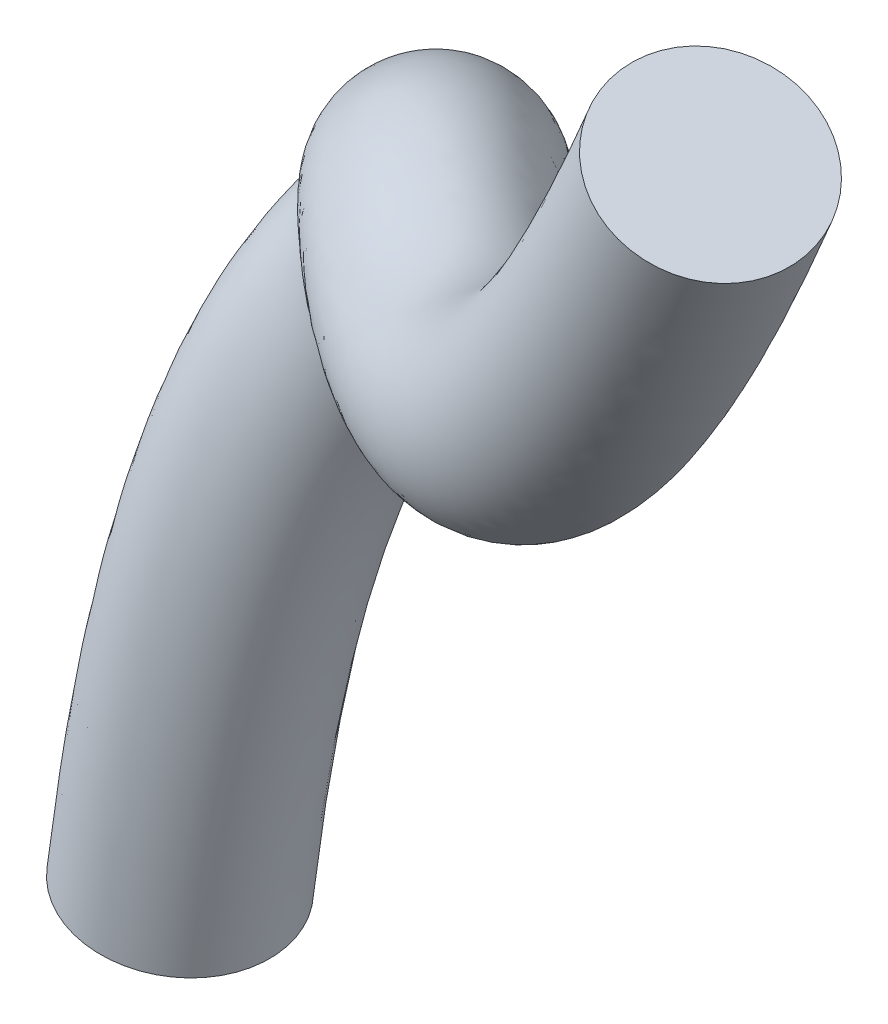
ISO-10303-21;
HEADER;
FILE_DESCRIPTION(('STEP AP214'),'2;1');
FILE_NAME('part.step','',(''),(''),'','','');
FILE_SCHEMA(('AUTOMOTIVE_DESIGN { 1 0 10303 214 1 1 1 1 }'));
ENDSEC;
DATA;
#1=APPLICATION_CONTEXT('core data for automotive mechanical design processes');
#2=APPLICATION_PROTOCOL_DEFINITION('international standard','automotive_design',2000,#1);
#3=PRODUCT_CONTEXT('',#1,'mechanical');
#4=PRODUCT('Part','Part','',(#3));
#5=PRODUCT_RELATED_PRODUCT_CATEGORY('part','',(#4));
#6=PRODUCT_DEFINITION_FORMATION('','',#4);
#7=PRODUCT_DEFINITION_CONTEXT('part definition',#1,'design');
#8=PRODUCT_DEFINITION('design','',#6,#7);
#9=PRODUCT_DEFINITION_SHAPE('','',#8);
#10=(LENGTH_UNIT() NAMED_UNIT(*) SI_UNIT(.MILLI.,.METRE.));
#11=(NAMED_UNIT(*) PLANE_ANGLE_UNIT() SI_UNIT($,.RADIAN.));
#12=(NAMED_UNIT(*) SI_UNIT($,.STERADIAN.) SOLID_ANGLE_UNIT());
#13=UNCERTAINTY_MEASURE_WITH_UNIT(LENGTH_MEASURE(1.E-05),#10,'distance_accuracy_value','');
#14=(GEOMETRIC_REPRESENTATION_CONTEXT(3) GLOBAL_UNCERTAINTY_ASSIGNED_CONTEXT((#13)) GLOBAL_UNIT_ASSIGNED_CONTEXT((#10,
#11,#12)) REPRESENTATION_CONTEXT('',''));
#15=CARTESIAN_POINT('',(0.,0.,0.));
#16=DIRECTION('',(0.,0.,1.));
#17=DIRECTION('',(1.,0.,0.));
#18=AXIS2_PLACEMENT_3D('',#15,#16,#17);
#19=CARTESIAN_POINT('',(-367.250145745959,649.801414733043,-209.696751853707));
#20=DIRECTION('',(-0.456903423556888,-0.874802979328157,-0.161117996823993));
#21=DIRECTION('',(0.886383445732628,-0.462951819449014,0.));
#22=AXIS2_PLACEMENT_3D('',#19,#20,#21);
#23=PLANE('',#22);
#24=CARTESIAN_POINT('',(-367.250145745959,649.801414733043,-209.696751853707));
#25=DIRECTION('',(-0.456903423556888,-0.874802979328157,-0.161117996823993));
#26=DIRECTION('',(0.886383445732628,-0.462951819449014,0.));
#27=AXIS2_PLACEMENT_3D('',#24,#25,#26);
#28=CIRCLE('',#27,12.);
#29=CARTESIAN_POINT('',(-356.613544397167,644.245992899654,-209.696751853707));
#30=VERTEX_POINT('',#29);
#31=EDGE_CURVE('E42',#30,#30,#28,.T.);
#32=ORIENTED_EDGE('',*,*,#31,.F.);
#33=EDGE_LOOP('',(#32));
#34=FACE_BOUND('',#33,.T.);
#35=ADVANCED_FACE('F36',(#34),#23,.F.);
#36=CARTESIAN_POINT('',(-484.754326872114,486.999999999999,-260.));
#37=DIRECTION('',(-0.170028664121391,-0.983972582034292,-0.0537420801780385));
#38=DIRECTION('',(0.815843360114547,-0.171145105946587,0.552366693843442));
#39=AXIS2_PLACEMENT_3D('',#36,#37,#38);
#40=PLANE('',#39);
#41=CARTESIAN_POINT('',(-484.754326872114,486.999999999999,-260.));
#42=DIRECTION('',(-0.170028664121391,-0.983972582034292,-0.0537420801780385));
#43=DIRECTION('',(0.815843360114547,-0.171145105946587,0.552366693843442));
#44=AXIS2_PLACEMENT_3D('',#41,#42,#43);
#45=CIRCLE('',#44,12.);
#46=CARTESIAN_POINT('',(-474.96420655074,484.94625872864,-253.371599673879));
#47=VERTEX_POINT('',#46);
#48=EDGE_CURVE('E11',#47,#47,#45,.T.);
#49=ORIENTED_EDGE('',*,*,#48,.T.);
#50=EDGE_LOOP('',(#49));
#51=FACE_BOUND('',#50,.T.);
#52=ADVANCED_FACE('F51',(#51),#40,.T.);
#53=CARTESIAN_POINT('',(-356.613544397167,644.245992899654,-209.696751853707));
#54=CARTESIAN_POINT('',(-362.965549367743,632.084226130244,-211.79833804842));
#55=CARTESIAN_POINT('',(-368.872510569864,622.083361143408,-213.827232761725));
#56=CARTESIAN_POINT('',(-380.013218858092,605.538771407674,-217.826724035162));
#57=CARTESIAN_POINT('',(-385.24819550299,598.989537435878,-219.797817560738));
#58=CARTESIAN_POINT('',(-392.810326691589,591.166742261286,-222.801425507889));
#59=CARTESIAN_POINT('',(-395.283340906363,588.89397952817,-223.810909996664));
#60=CARTESIAN_POINT('',(-400.161476384925,584.945958431369,-225.855949682507));
#61=CARTESIAN_POINT('',(-402.567148837299,583.271157005617,-226.892211325162));
#62=CARTESIAN_POINT('',(-407.313336642948,580.463780915998,-228.979800196814));
#63=CARTESIAN_POINT('',(-409.653199584011,579.332436632377,-230.031984775113));
#64=CARTESIAN_POINT('',(-414.24054832241,577.54766996629,-232.094895385123));
#65=CARTESIAN_POINT('',(-416.484690842979,576.894351800388,-233.107460903559));
#66=CARTESIAN_POINT('',(-419.779595791993,576.195423581914,-234.493329165506));
#67=CARTESIAN_POINT('',(-420.86644459632,576.008854412808,-234.932502426258));
#68=CARTESIAN_POINT('',(-423.032942676545,575.716412045197,-235.730519645917));
#69=CARTESIAN_POINT('',(-424.117094336351,575.609391779118,-236.082334459101));
#70=CARTESIAN_POINT('',(-425.75244505775,575.511251741903,-236.5263916598));
#71=CARTESIAN_POINT('',(-426.248362113883,575.49249597272,-236.737741010738));
#72=CARTESIAN_POINT('',(-426.914302582201,575.47506623274,-237.147035863975));
#73=CARTESIAN_POINT('',(-427.124472338888,575.471166860122,-237.297043178954));
#74=CARTESIAN_POINT('',(-427.547258317756,575.465928067888,-237.58524968833));
#75=CARTESIAN_POINT('',(-427.756379747398,575.464717052723,-237.728657177676));
#76=CARTESIAN_POINT('',(-428.790575630487,575.464949743949,-238.441997831771));
#77=CARTESIAN_POINT('',(-429.581324268998,575.485195539696,-239.000867708858));
#78=CARTESIAN_POINT('',(-433.349262334373,575.640710043394,-241.726076364418));
#79=CARTESIAN_POINT('',(-435.763426085446,575.907266124603,-243.682857673205));
#80=CARTESIAN_POINT('',(-438.536807362079,575.952205438294,-246.107922905081));
#81=CARTESIAN_POINT('',(-439.319883281238,575.91524427779,-246.829887965409));
#82=CARTESIAN_POINT('',(-440.655819701364,575.727944075397,-248.109484905362));
#83=CARTESIAN_POINT('',(-441.208029641824,575.581554049806,-248.665634763851));
#84=CARTESIAN_POINT('',(-442.212461316555,575.168126087815,-249.713774409623));
#85=CARTESIAN_POINT('',(-442.668667006084,574.904006447499,-250.209782700634));
#86=CARTESIAN_POINT('',(-443.647222405343,574.116383144308,-251.313778807673));
#87=CARTESIAN_POINT('',(-444.172034115258,573.588015956671,-251.925628393449));
#88=CARTESIAN_POINT('',(-445.141144040246,572.311333144339,-253.096051895922));
#89=CARTESIAN_POINT('',(-445.577521023832,571.664285781416,-253.634087591539));
#90=CARTESIAN_POINT('',(-446.500297995052,570.1854031009,-254.732880794378));
#91=CARTESIAN_POINT('',(-446.988275518871,569.353624872231,-255.29502170004));
#92=CARTESIAN_POINT('',(-447.989369348833,567.618023921371,-256.340423113501));
#93=CARTESIAN_POINT('',(-448.503219593957,566.713992224033,-256.823945546633));
#94=CARTESIAN_POINT('',(-449.54048402287,564.941008194765,-257.630214291942));
#95=CARTESIAN_POINT('',(-450.06434256438,564.0721555243,-257.952532531036));
#96=CARTESIAN_POINT('',(-450.927551481147,562.743204029101,-258.303935525406));
#97=CARTESIAN_POINT('',(-451.25394594104,562.267275284781,-258.389924385395));
#98=CARTESIAN_POINT('',(-451.883389399526,561.37125524975,-258.487674041023));
#99=CARTESIAN_POINT('',(-452.187065820191,560.950661488134,-258.499609661315));
#100=CARTESIAN_POINT('',(-452.799639617763,560.101845413214,-258.468392481633));
#101=CARTESIAN_POINT('',(-453.109037678483,559.673240357225,-258.424963278265));
#102=CARTESIAN_POINT('',(-453.758606695109,558.750829925331,-258.285904840838));
#103=CARTESIAN_POINT('',(-454.098723038565,558.25691693424,-258.190120058568));
#104=CARTESIAN_POINT('',(-455.183788335056,556.606843096302,-257.824854987914));
#105=CARTESIAN_POINT('',(-455.995667253391,555.280383446162,-257.474025186175));
#106=CARTESIAN_POINT('',(-457.791334487017,551.881212360331,-256.624179185349));
#107=CARTESIAN_POINT('',(-458.772162738027,549.810257493329,-256.127340126382));
#108=CARTESIAN_POINT('',(-460.862801312871,544.678733979243,-255.116291727384));
#109=CARTESIAN_POINT('',(-461.972152220914,541.619032610345,-254.603193364911));
#110=CARTESIAN_POINT('',(-464.296359999242,534.272827245149,-253.696262178354));
#111=CARTESIAN_POINT('',(-465.511439510963,529.986562203743,-253.302507345134));
#112=CARTESIAN_POINT('',(-469.304771864371,514.917136244744,-252.491103120897));
#113=CARTESIAN_POINT('',(-472.030003559635,501.926779675001,-252.444166801993));
#114=CARTESIAN_POINT('',(-474.96420655074,484.94625872864,-253.371599673879));
#115=CARTESIAN_POINT('',(-358.403701271783,640.818497094989,-186.010308244055));
#116=CARTESIAN_POINT('',(-365.144782663187,628.50155511378,-188.163754069588));
#117=CARTESIAN_POINT('',(-371.490024392841,618.310265377758,-190.26325213257));
#118=CARTESIAN_POINT('',(-383.695891123809,601.305682683665,-194.484322740688));
#119=CARTESIAN_POINT('',(-389.559245793408,594.480115470486,-196.606517833895));
#120=CARTESIAN_POINT('',(-398.31471835046,586.261169231973,-199.957911510642));
#121=CARTESIAN_POINT('',(-401.227874959451,583.861042709371,-201.10399089736));
#122=CARTESIAN_POINT('',(-407.078875145814,579.717354678688,-203.471057225957));
#123=CARTESIAN_POINT('',(-410.017943052392,577.974124805835,-204.693233848368));
#124=CARTESIAN_POINT('',(-415.903648022802,575.173318752093,-207.194827255408));
#125=CARTESIAN_POINT('',(-418.849610922798,574.116524433362,-208.475279619781));
#126=CARTESIAN_POINT('',(-424.659974445279,572.748010745551,-211.002951677758));
#127=CARTESIAN_POINT('',(-427.520634885724,572.430904854612,-212.250742107218));
#128=CARTESIAN_POINT('',(-431.678985949822,572.606498529081,-213.957910605253));
#129=CARTESIAN_POINT('',(-433.043418478686,572.774065268403,-214.498771803381));
#130=CARTESIAN_POINT('',(-435.727261290851,573.384278216624,-215.489587662228));
#131=CARTESIAN_POINT('',(-437.053271197339,573.842399823587,-215.931261420722));
#132=CARTESIAN_POINT('',(-438.99270017977,574.786117875555,-216.518818226049));
#133=CARTESIAN_POINT('',(-439.569390855245,574.962261029867,-216.780808296573));
#134=CARTESIAN_POINT('',(-440.350052101583,575.007119482997,-217.265783627129));
#135=CARTESIAN_POINT('',(-440.597431032136,574.989952707374,-217.441316302034));
#136=CARTESIAN_POINT('',(-441.095452519476,574.983735454956,-217.780805818888));
#137=CARTESIAN_POINT('',(-441.342204015649,574.982272722047,-217.950014259294));
#138=CARTESIAN_POINT('',(-442.564534569517,574.982448176139,-218.793112984449));
#139=CARTESIAN_POINT('',(-443.505711229079,575.006396234162,-219.458188700213));
#140=CARTESIAN_POINT('',(-448.021453302048,575.192199771342,-222.724199827963));
#141=CARTESIAN_POINT('',(-451.019892049865,575.523509169419,-225.146142729506));
#142=CARTESIAN_POINT('',(-454.605071127644,575.580826620835,-228.280915771481));
#143=CARTESIAN_POINT('',(-455.647906113723,575.533384991232,-229.241241021294));
#144=CARTESIAN_POINT('',(-457.461850383353,575.278805407465,-230.978628107348));
#145=CARTESIAN_POINT('',(-458.231646933413,575.074691845565,-231.753647174685));
#146=CARTESIAN_POINT('',(-459.602427617188,574.510307382291,-233.184039813478));
#147=CARTESIAN_POINT('',(-460.206393675525,574.153601974126,-233.84211876738));
#148=CARTESIAN_POINT('',(-461.405037717676,573.188598073237,-235.194393073932));
#149=CARTESIAN_POINT('',(-462.002806548908,572.576969292771,-235.892820374099));
#150=CARTESIAN_POINT('',(-463.049904617405,571.197545221777,-237.15743255937));
#151=CARTESIAN_POINT('',(-463.439031041265,570.610576260923,-237.636978701169));
#152=CARTESIAN_POINT('',(-464.158686038155,569.456698969659,-238.493987399365));
#153=CARTESIAN_POINT('',(-464.489602741653,568.888610265917,-238.870876718935));
#154=CARTESIAN_POINT('',(-465.03407112552,567.943712669809,-239.439615451381));
#155=CARTESIAN_POINT('',(-465.250028600015,567.565491576652,-239.629604375946));
#156=CARTESIAN_POINT('',(-465.432323511287,567.252582676757,-239.771544345595));
#157=CARTESIAN_POINT('',(-465.403209437764,567.318566010693,-239.715590269799));
#158=CARTESIAN_POINT('',(-464.893569211297,568.103181411785,-239.508121292826));
#159=CARTESIAN_POINT('',(-464.648757342,568.462493822453,-239.440983355562));
#160=CARTESIAN_POINT('',(-464.21430826568,569.08208667198,-239.373396910322));
#161=CARTESIAN_POINT('',(-464.028332522309,569.340088888924,-239.371783963397));
#162=CARTESIAN_POINT('',(-463.838172426224,569.605344887328,-239.381588229688));
#163=CARTESIAN_POINT('',(-463.834535118591,569.612625090672,-239.390298131964));
#164=CARTESIAN_POINT('',(-464.04797673696,569.311143480677,-239.345081645524));
#165=CARTESIAN_POINT('',(-464.26314551323,569.003274862247,-239.290123367879));
#166=CARTESIAN_POINT('',(-465.189912410518,567.594418780386,-238.978398209243));
#167=CARTESIAN_POINT('',(-466.176432188832,566.009128243984,-238.565384967918));
#168=CARTESIAN_POINT('',(-468.464095942232,561.679178653659,-237.483055030424));
#169=CARTESIAN_POINT('',(-469.760123418744,558.941461029194,-236.827373387191));
#170=CARTESIAN_POINT('',(-472.42724309591,552.395189850384,-235.537658753901));
#171=CARTESIAN_POINT('',(-473.802236141858,548.586857219146,-234.903893086487));
#172=CARTESIAN_POINT('',(-476.576389645976,539.818568993637,-233.82141583584));
#173=CARTESIAN_POINT('',(-477.978191431169,534.856483933931,-233.370857110266));
#174=CARTESIAN_POINT('',(-482.237929703309,517.934218961823,-232.459689568738));
#175=CARTESIAN_POINT('',(-485.15434670179,503.942950562333,-232.434875670104));
#176=CARTESIAN_POINT('',(-488.229279574181,486.148011971536,-233.40678996214));
#177=CARTESIAN_POINT('',(-379.676903969366,651.929340761766,-186.010308244055));
#178=CARTESIAN_POINT('',(-386.07827186373,640.262825908131,-188.320607389572));
#179=CARTESIAN_POINT('',(-391.98779900685,630.841619022392,-190.556720884071));
#180=CARTESIAN_POINT('',(-402.92511227065,615.704221737315,-194.930236891611));
#181=CARTESIAN_POINT('',(-407.95316893799,609.986775518659,-197.067268025384));
#182=CARTESIAN_POINT('',(-414.900166193722,603.627660519953,-200.239339090417));
#183=CARTESIAN_POINT('',(-417.116524089359,601.877766646489,-201.29114036771));
#184=CARTESIAN_POINT('',(-421.359558889448,599.034253307961,-203.393361105259));
#185=CARTESIAN_POINT('',(-423.386357745566,597.940051604783,-204.443557353464));
#186=CARTESIAN_POINT('',(-427.256263041821,596.342364195361,-206.558643377032));
#187=CARTESIAN_POINT('',(-429.100000142621,595.837199594377,-207.622854033955));
#188=CARTESIAN_POINT('',(-432.59766867282,595.40041506523,-209.800276800895));
#189=CARTESIAN_POINT('',(-434.254546473447,595.463200186469,-210.910380674262));
#190=CARTESIAN_POINT('',(-436.551526549147,596.080865734397,-212.685266514437));
#191=CARTESIAN_POINT('',(-437.285355323407,596.375364862232,-213.295647003752));
#192=CARTESIAN_POINT('',(-438.659857047008,597.197178162466,-214.590388992169));
#193=CARTESIAN_POINT('',(-439.298124851483,597.742261870758,-215.280527880423));
#194=CARTESIAN_POINT('',(-440.143473936506,598.761750271998,-216.412384047595));
#195=CARTESIAN_POINT('',(-440.446500967708,598.946919710875,-216.729858608702));
#196=CARTESIAN_POINT('',(-440.961816808963,598.999032028667,-217.114724419091));
#197=CARTESIAN_POINT('',(-441.142581374708,598.982982504628,-217.229936758967));
#198=CARTESIAN_POINT('',(-441.498963628001,598.978519818042,-217.472826561201));
#199=CARTESIAN_POINT('',(-441.677679839788,598.977437591586,-217.595339032024));
#200=CARTESIAN_POINT('',(-442.57400210955,598.977538000974,-218.213470567701));
#201=CARTESIAN_POINT('',(-443.29989422038,598.995220211395,-218.72575885772));
#202=CARTESIAN_POINT('',(-446.98128417552,599.146565088249,-221.387685888489));
#203=CARTESIAN_POINT('',(-450.098087807732,599.503431854254,-223.842161774731));
#204=CARTESIAN_POINT('',(-455.106221225831,599.58378100652,-228.219886270124));
#205=CARTESIAN_POINT('',(-456.831089722312,599.52704948757,-229.796298456729));
#206=CARTESIAN_POINT('',(-460.348002710569,599.033745590792,-233.164237778032));
#207=CARTESIAN_POINT('',(-462.140035588833,598.592299582971,-234.956686184939));
#208=CARTESIAN_POINT('',(-465.662314293072,597.142443450419,-238.631702139125));
#209=CARTESIAN_POINT('',(-467.387574132134,596.131762236681,-240.508938061047));
#210=CARTESIAN_POINT('',(-470.632144736534,593.520269867738,-244.168744242423));
#211=CARTESIAN_POINT('',(-472.149622348187,591.925855481832,-245.947822910095));
#212=CARTESIAN_POINT('',(-474.440544854774,588.90784785169,-248.71463675459));
#213=CARTESIAN_POINT('',(-475.180409401031,587.782529701893,-249.625215033621));
#214=CARTESIAN_POINT('',(-476.503709229579,585.661718711786,-251.2003440267));
#215=CARTESIAN_POINT('',(-477.084377568536,584.664931311884,-251.861554714796));
#216=CARTESIAN_POINT('',(-478.096735707496,582.909639456599,-252.91797599435));
#217=CARTESIAN_POINT('',(-478.529363422869,582.150140740252,-253.310802254516));
#218=CARTESIAN_POINT('',(-479.160984441968,581.070157383832,-253.801027522839));
#219=CARTESIAN_POINT('',(-479.363637519078,580.750144552617,-253.891377563081));
#220=CARTESIAN_POINT('',(-479.299872462661,580.848313851741,-253.865419452034));
#221=CARTESIAN_POINT('',(-479.280674595078,580.87503474991,-253.86472550049));
#222=CARTESIAN_POINT('',(-479.368731879532,580.750080948401,-253.878908507132));
#223=CARTESIAN_POINT('',(-479.47839365052,580.59713297979,-253.892271372346));
#224=CARTESIAN_POINT('',(-479.895490276792,580.019606227958,-253.872126152197));
#225=CARTESIAN_POINT('',(-480.202470809488,579.595819364529,-253.836463557087));
#226=CARTESIAN_POINT('',(-481.003862096383,578.458014019768,-253.666320880167));
#227=CARTESIAN_POINT('',(-481.496471925486,577.745103974478,-253.531120000822));
#228=CARTESIAN_POINT('',(-483.171273374351,575.198231842957,-252.967861641709));
#229=CARTESIAN_POINT('',(-484.539670645355,572.961002818709,-252.379629970309));
#230=CARTESIAN_POINT('',(-487.382343767603,567.579909769838,-251.034871263932));
#231=CARTESIAN_POINT('',(-488.857423247059,564.439474051775,-250.287624996302));
#232=CARTESIAN_POINT('',(-491.774445338839,557.279618114172,-248.877130528237));
#233=CARTESIAN_POINT('',(-493.221207625584,553.258684272154,-248.211927692749));
#234=CARTESIAN_POINT('',(-496.09233961706,544.183816675738,-247.091627438459));
#235=CARTESIAN_POINT('',(-497.518905364525,539.127275549738,-246.634526895392));
#236=CARTESIAN_POINT('',(-501.825459840929,522.01902162547,-245.713347295059));
#237=CARTESIAN_POINT('',(-504.738683331858,508.026729228422,-245.692970963879));
#238=CARTESIAN_POINT('',(-507.80952021693,490.255494514254,-246.663590614382));
#239=CARTESIAN_POINT('',(-377.88674709475,655.356836566431,-209.696751853707));
#240=CARTESIAN_POINT('',(-383.899038568286,643.845496924971,-211.955191368403));
#241=CARTESIAN_POINT('',(-389.370285183739,634.614714788309,-214.120701513092));
#242=CARTESIAN_POINT('',(-399.242440005067,619.937310461056,-218.272638186219));
#243=CARTESIAN_POINT('',(-403.642118647572,614.496197483865,-220.258567752273));
#244=CARTESIAN_POINT('',(-409.39577453485,608.533233549359,-223.082853087641));
#245=CARTESIAN_POINT('',(-411.171990036387,606.910703465365,-223.998059467014));
#246=CARTESIAN_POINT('',(-414.442160128442,604.262857060565,-225.778253561809));
#247=CARTESIAN_POINT('',(-415.935563530473,603.237083804499,-226.642534830242));
#248=CARTESIAN_POINT('',(-418.665951661967,601.632826359332,-228.343616318454));
#249=CARTESIAN_POINT('',(-419.903588803863,601.053111793392,-229.179559189245));
#250=CARTESIAN_POINT('',(-422.178242549922,600.200074285969,-230.892220508303));
#251=CARTESIAN_POINT('',(-423.218602430728,599.926647132246,-231.767099470603));
#252=CARTESIAN_POINT('',(-424.652136391305,599.66979078723,-233.22068507469));
#253=CARTESIAN_POINT('',(-425.108381441016,599.610154006662,-233.72937762661));
#254=CARTESIAN_POINT('',(-425.965538432728,599.529311991013,-234.831320975878));
#255=CARTESIAN_POINT('',(-426.361947990459,599.509253826266,-235.431600918791));
#256=CARTESIAN_POINT('',(-426.903218814504,599.486884138359,-236.419957481351));
#257=CARTESIAN_POINT('',(-427.125472226358,599.477154653751,-236.686791322861));
#258=CARTESIAN_POINT('',(-427.526067289576,599.466978778398,-236.99597665594));
#259=CARTESIAN_POINT('',(-427.669622681466,599.464196657376,-237.085663635888));
#260=CARTESIAN_POINT('',(-427.950769426275,599.460712430973,-237.277270430643));
#261=CARTESIAN_POINT('',(-428.091855571546,599.459881922262,-237.373981950408));
#262=CARTESIAN_POINT('',(-428.800043170484,599.460039568784,-237.862355415017));
#263=CARTESIAN_POINT('',(-429.375507260311,599.474019516974,-238.268437866359));
#264=CARTESIAN_POINT('',(-432.3090932078,599.595075360117,-240.389562424967));
#265=CARTESIAN_POINT('',(-434.841621843356,599.887188809437,-242.37887671843));
#266=CARTESIAN_POINT('',(-439.037957460243,599.955159823979,-246.046893403723));
#267=CARTESIAN_POINT('',(-440.50306688989,599.90890877417,-247.384945400854));
#268=CARTESIAN_POINT('',(-443.541972028517,599.482884258682,-250.295094576035));
#269=CARTESIAN_POINT('',(-445.116418297179,599.099161787212,-251.86867377404));
#270=CARTESIAN_POINT('',(-448.272347992504,597.800262155942,-255.161436735336));
#271=CARTESIAN_POINT('',(-449.84984746267,596.882166710053,-256.876601994277));
#272=CARTESIAN_POINT('',(-452.874329424224,594.448054938808,-260.288129976188));
#273=CARTESIAN_POINT('',(-454.318849914537,592.936902145732,-261.980630929404));
#274=CARTESIAN_POINT('',(-456.531784277614,590.021635774252,-264.653256091167));
#275=CARTESIAN_POINT('',(-457.318899383618,588.836239222425,-265.62232392401));
#276=CARTESIAN_POINT('',(-458.845321186457,586.390422842989,-267.439237421694));
#277=CARTESIAN_POINT('',(-459.583050345754,585.129945918237,-268.28569969592));
#278=CARTESIAN_POINT('',(-461.052033930809,582.583950708122,-269.81878365645));
#279=CARTESIAN_POINT('',(-461.782554416812,581.298641387633,-270.505143425241));
#280=CARTESIAN_POINT('',(-463.269144953552,578.75858290184,-271.659697469148));
#281=CARTESIAN_POINT('',(-464.024770645727,577.503734066225,-272.128319824301));
#282=CARTESIAN_POINT('',(-465.333854732489,575.488336469057,-272.661233684626));
#283=CARTESIAN_POINT('',(-465.885863194118,574.679816212195,-272.813666530323));
#284=CARTESIAN_POINT('',(-467.037813013378,573.039249526214,-272.993185637833));
#285=CARTESIAN_POINT('',(-467.637126948391,572.207705579,-273.020097070264));
#286=CARTESIAN_POINT('',(-468.856957468341,570.516106753844,-272.958930404142));
#287=CARTESIAN_POINT('',(-469.47697336938,569.656434631082,-272.871128703341));
#288=CARTESIAN_POINT('',(-470.714492054532,567.897700464423,-272.607144075527));
#289=CARTESIAN_POINT('',(-471.332049450833,566.998746046445,-272.431116691561));
#290=CARTESIAN_POINT('',(-473.165149298863,564.210656158923,-271.81431842028));
#291=CARTESIAN_POINT('',(-474.358905709883,562.232258020698,-271.288270188503));
#292=CARTESIAN_POINT('',(-476.70958231242,557.781943476699,-270.17599541892));
#293=CARTESIAN_POINT('',(-477.869462566342,555.308270515744,-269.587591735493));
#294=CARTESIAN_POINT('',(-480.2100035558,549.563162243197,-268.455763501719));
#295=CARTESIAN_POINT('',(-481.391123704695,546.290859663463,-267.911227970953));
#296=CARTESIAN_POINT('',(-483.812309970271,538.63807492714,-266.966473781192));
#297=CARTESIAN_POINT('',(-485.052153444246,534.257353819405,-266.566177130114));
#298=CARTESIAN_POINT('',(-488.892302002136,519.001938908681,-265.744760847509));
#299=CARTESIAN_POINT('',(-491.614340189942,506.010558340611,-265.702262095768));
#300=CARTESIAN_POINT('',(-494.544447193489,489.053741271358,-266.628400326121));
#301=CARTESIAN_POINT('',(-376.096590220135,658.784332371096,-233.38319546336));
#302=CARTESIAN_POINT('',(-381.719805272843,647.42816794181,-235.589775347235));
#303=CARTESIAN_POINT('',(-386.752771360629,638.387810554227,-237.684682142114));
#304=CARTESIAN_POINT('',(-395.559767739483,624.170399184798,-241.615039480827));
#305=CARTESIAN_POINT('',(-399.331068357155,619.005619449071,-243.449867479162));
#306=CARTESIAN_POINT('',(-403.891382875979,613.438806578765,-245.926367084864));
#307=CARTESIAN_POINT('',(-405.227455983415,611.943640284241,-246.704978566318));
#308=CARTESIAN_POINT('',(-407.524761367436,609.491460813168,-248.163146018359));
#309=CARTESIAN_POINT('',(-408.48476931538,608.534116004215,-248.84151230702));
#310=CARTESIAN_POINT('',(-410.075640282114,606.923288523303,-250.128589259876));
#311=CARTESIAN_POINT('',(-410.707177465105,606.269023992407,-250.736264344534));
#312=CARTESIAN_POINT('',(-411.758816427023,604.999733506708,-251.984164215712));
#313=CARTESIAN_POINT('',(-412.182658388009,604.390094078022,-252.623818266944));
#314=CARTESIAN_POINT('',(-412.752746233463,603.258715840063,-253.756103634943));
#315=CARTESIAN_POINT('',(-412.931407558625,602.844943151092,-254.163108249468));
#316=CARTESIAN_POINT('',(-413.271219818448,601.861445819561,-255.072252959586));
#317=CARTESIAN_POINT('',(-413.425771129434,601.276245781773,-255.582673957159));
#318=CARTESIAN_POINT('',(-413.662963692502,600.21201800472,-256.427530915107));
#319=CARTESIAN_POINT('',(-413.804443485008,600.007389596627,-256.64372403702));
#320=CARTESIAN_POINT('',(-414.090317770189,599.93492552813,-256.877228892789));
#321=CARTESIAN_POINT('',(-414.196663988224,599.945410810123,-256.941390512808));
#322=CARTESIAN_POINT('',(-414.40257522455,599.942905043905,-257.081714300085));
#323=CARTESIAN_POINT('',(-414.506031303304,599.942326252938,-257.152624868791));
#324=CARTESIAN_POINT('',(-415.02608423142,599.942541136594,-257.511240262333));
#325=CARTESIAN_POINT('',(-415.451120300242,599.952818822553,-257.811116874998));
#326=CARTESIAN_POINT('',(-417.636902240079,600.043585631984,-259.391438961446));
#327=CARTESIAN_POINT('',(-419.585155878979,600.27094576462,-260.915591662129));
#328=CARTESIAN_POINT('',(-422.969693694656,600.326538641437,-263.873900537323));
#329=CARTESIAN_POINT('',(-424.175044057469,600.290768060769,-264.97359234498));
#330=CARTESIAN_POINT('',(-426.735941346465,599.932022926572,-267.425951374038));
#331=CARTESIAN_POINT('',(-428.092801005524,599.606023991452,-268.780661363141));
#332=CARTESIAN_POINT('',(-430.882381691937,598.458080861466,-271.691171331547));
#333=CARTESIAN_POINT('',(-432.312120793206,597.632571183426,-273.244265927506));
#334=CARTESIAN_POINT('',(-435.116514111914,595.375840009878,-276.407515709952));
#335=CARTESIAN_POINT('',(-436.488077480887,593.947948809632,-278.013438948713));
#336=CARTESIAN_POINT('',(-438.623023700455,591.135423696813,-280.591875427745));
#337=CARTESIAN_POINT('',(-439.457389366204,589.889948742956,-281.619432814399));
#338=CARTESIAN_POINT('',(-441.186933143335,587.119126974191,-283.678130816689));
#339=CARTESIAN_POINT('',(-442.081723122973,585.59496052459,-284.709844677044));
#340=CARTESIAN_POINT('',(-444.007332154122,582.258261959646,-286.719591318551));
#341=CARTESIAN_POINT('',(-445.035745410754,580.447142035013,-287.699484595965));
#342=CARTESIAN_POINT('',(-447.377305465135,576.447008419848,-289.518367415458));
#343=CARTESIAN_POINT('',(-448.685903772377,574.257323579832,-290.365262085521));
#344=CARTESIAN_POINT('',(-451.367837002316,570.128359086373,-291.457047917218));
#345=CARTESIAN_POINT('',(-452.491051793158,568.48459767448,-291.762607560157));
#346=CARTESIAN_POINT('',(-454.706894147224,565.328418104027,-292.107462768534));
#347=CARTESIAN_POINT('',(-455.795860246261,563.81827817821,-292.147922768182));
#348=CARTESIAN_POINT('',(-457.818424659891,561.01260727973,-292.045734656088));
#349=CARTESIAN_POINT('',(-458.751475929272,559.717049897634,-291.905793849596));
#350=CARTESIAN_POINT('',(-460.425122012681,557.337386909077,-291.547967270888));
#351=CARTESIAN_POINT('',(-461.167626976181,556.252388118413,-291.331113382301));
#352=CARTESIAN_POINT('',(-463.159025223376,553.223080474888,-290.660775198851));
#353=CARTESIAN_POINT('',(-464.178140774411,551.503513222687,-290.196910406698));
#354=CARTESIAN_POINT('',(-466.036820857236,547.983977183561,-289.317119573908));
#355=CARTESIAN_POINT('',(-466.881501885625,546.177066979713,-288.887558474683));
#356=CARTESIAN_POINT('',(-468.645561772761,541.846706372221,-288.034396475201));
#357=CARTESIAN_POINT('',(-469.561039783807,539.323035054773,-287.610528249157));
#358=CARTESIAN_POINT('',(-471.532280323481,533.092333178543,-286.841320123926));
#359=CARTESIAN_POINT('',(-472.585401523968,529.387432089072,-286.497827364837));
#360=CARTESIAN_POINT('',(-475.959144163342,515.984856191892,-285.776174399958));
#361=CARTESIAN_POINT('',(-478.489997048026,503.9943874528,-285.711553227657));
#362=CARTESIAN_POINT('',(-481.279374170047,487.851988028461,-286.59321003786));
#363=CARTESIAN_POINT('',(-354.823387522552,647.67348870432,-233.38319546336));
#364=CARTESIAN_POINT('',(-360.786316072299,635.666897146708,-235.432922027252));
#365=CARTESIAN_POINT('',(-366.254996746888,625.856456909058,-237.39121339088));
#366=CARTESIAN_POINT('',(-376.330546592375,609.771860131683,-241.169125329636));
#367=CARTESIAN_POINT('',(-380.937145212573,603.498959401269,-242.989117287581));
#368=CARTESIAN_POINT('',(-387.305935032717,596.0723152906,-245.644939505135));
#369=CARTESIAN_POINT('',(-389.338806853276,593.926916346968,-246.517829095968));
#370=CARTESIAN_POINT('',(-393.244077624035,590.174562184049,-248.240842139057));
#371=CARTESIAN_POINT('',(-395.116354622205,588.568189205399,-249.091188801956));
#372=CARTESIAN_POINT('',(-398.723025263094,585.754243079904,-250.764773138219));
#373=CARTESIAN_POINT('',(-400.456788245225,584.548348831392,-251.588689930446));
#374=CARTESIAN_POINT('',(-403.82112219954,582.347329187029,-253.186839092489));
#375=CARTESIAN_POINT('',(-405.448746800234,581.357798746165,-253.9641796999));
#376=CARTESIAN_POINT('',(-407.880205634164,579.784348634747,-255.028747725759));
#377=CARTESIAN_POINT('',(-408.689470713955,579.243643557213,-255.366233049134));
#378=CARTESIAN_POINT('',(-410.33862406224,578.048545873769,-255.971451629607));
#379=CARTESIAN_POINT('',(-411.180917475363,577.37638373465,-256.233407497481));
#380=CARTESIAN_POINT('',(-412.512189935729,576.236385608252,-256.53396509355));
#381=CARTESIAN_POINT('',(-412.927333372521,576.022730915572,-256.694673724903));
#382=CARTESIAN_POINT('',(-413.47855306282,575.943012982484,-257.028288100821));
#383=CARTESIAN_POINT('',(-413.65151364564,575.95238101287,-257.152770055874));
#384=CARTESIAN_POINT('',(-413.999064116036,575.948120680819,-257.389693557772));
#385=CARTESIAN_POINT('',(-414.170555479147,575.947161383399,-257.507300096058));
#386=CARTESIAN_POINT('',(-415.016616691457,575.947451311759,-258.090882679093));
#387=CARTESIAN_POINT('',(-415.656937308918,575.963994845229,-258.543546717502));
#388=CARTESIAN_POINT('',(-418.677071366698,576.089220315445,-260.727952900874));
#389=CARTESIAN_POINT('',(-420.506960121027,576.291023079786,-262.219572616904));
#390=CARTESIAN_POINT('',(-422.468543596513,576.323584255753,-263.934930038681));
#391=CARTESIAN_POINT('',(-422.991860448754,576.297103564347,-264.418534909524));
#392=CARTESIAN_POINT('',(-423.849789019375,576.177082743329,-265.240341703375));
#393=CARTESIAN_POINT('',(-424.184412350234,576.088416254047,-265.577622353017));
#394=CARTESIAN_POINT('',(-424.822495015923,575.825944793339,-266.243509005769));
#395=CARTESIAN_POINT('',(-425.130940336644,575.654410920872,-266.577446633887));
#396=CARTESIAN_POINT('',(-425.889407093009,575.044168215378,-267.433164541414));
#397=CARTESIAN_POINT('',(-426.341261681609,574.599062620571,-267.9584364128));
#398=CARTESIAN_POINT('',(-427.232383463086,573.4251210669,-269.034671232473));
#399=CARTESIAN_POINT('',(-427.7160110064,572.717995301909,-269.631196481909));
#400=CARTESIAN_POINT('',(-428.841909951948,570.914107232141,-270.971774189392));
#401=CARTESIAN_POINT('',(-429.48694829609,569.818639478546,-271.719166681145));
#402=CARTESIAN_POINT('',(-430.944667572146,567.292335172933,-273.241230775621));
#403=CARTESIAN_POINT('',(-431.756410587899,565.862492871413,-274.01828671732));
#404=CARTESIAN_POINT('',(-433.648644534454,562.629433712773,-275.488884238289));
#405=CARTESIAN_POINT('',(-434.725475690995,560.825745037908,-276.189474792273));
#406=CARTESIAN_POINT('',(-436.961533750997,557.383226646417,-277.099749757987));
#407=CARTESIAN_POINT('',(-437.85913454008,556.072056747109,-277.338865415229));
#408=CARTESIAN_POINT('',(-439.552470533372,553.66042382752,-277.601951171723));
#409=CARTESIAN_POINT('',(-440.345799118073,552.561234087345,-277.627435359233));
#410=CARTESIAN_POINT('',(-441.761106809301,550.5983459391,-277.555196733579));
#411=CARTESIAN_POINT('',(-442.383540238375,549.733855623778,-277.459628424566));
#412=CARTESIAN_POINT('',(-443.469236653259,548.190516369986,-277.226728036152));
#413=CARTESIAN_POINT('',(-443.9343005639,547.510559006232,-277.090116749257));
#414=CARTESIAN_POINT('',(-445.177664259593,545.619267412217,-276.671311766585));
#415=CARTESIAN_POINT('',(-445.81490231795,544.55163864834,-276.382665404433));
#416=CARTESIAN_POINT('',(-447.118573031802,542.083246067003,-275.765303340274));
#417=CARTESIAN_POINT('',(-447.78420205731,540.679053957464,-275.427306865572));
#418=CARTESIAN_POINT('',(-449.298359529832,536.962278108102,-274.694924700866));
#419=CARTESIAN_POINT('',(-450.142068299971,534.651208001545,-274.302493643334));
#420=CARTESIAN_POINT('',(-452.016330352508,528.727085496662,-273.571108520867));
#421=CARTESIAN_POINT('',(-453.044687590757,525.116640473555,-273.234157580001));
#422=CARTESIAN_POINT('',(-456.371614025432,511.900053527666,-272.522516673057));
#423=CARTESIAN_POINT('',(-458.90566041748,499.910608787669,-272.453457933882));
#424=CARTESIAN_POINT('',(-461.699133527298,483.744505485743,-273.336409385618));
#425=CARTESIAN_POINT('',(-356.613544397167,644.245992899654,-209.696751853707));
#426=CARTESIAN_POINT('',(-362.965549367743,632.084226130244,-211.79833804842));
#427=CARTESIAN_POINT('',(-368.872510569864,622.083361143408,-213.827232761725));
#428=CARTESIAN_POINT('',(-380.013218858092,605.538771407674,-217.826724035162));
#429=CARTESIAN_POINT('',(-385.24819550299,598.989537435878,-219.797817560738));
#430=CARTESIAN_POINT('',(-392.810326691589,591.166742261286,-222.801425507889));
#431=CARTESIAN_POINT('',(-395.283340906363,588.89397952817,-223.810909996664));
#432=CARTESIAN_POINT('',(-400.161476384925,584.945958431369,-225.855949682507));
#433=CARTESIAN_POINT('',(-402.567148837299,583.271157005617,-226.892211325162));
#434=CARTESIAN_POINT('',(-407.313336642948,580.463780915998,-228.979800196814));
#435=CARTESIAN_POINT('',(-409.653199584011,579.332436632377,-230.031984775113));
#436=CARTESIAN_POINT('',(-414.24054832241,577.54766996629,-232.094895385123));
#437=CARTESIAN_POINT('',(-416.484690842979,576.894351800388,-233.107460903559));
#438=CARTESIAN_POINT('',(-419.779595791993,576.195423581914,-234.493329165506));
#439=CARTESIAN_POINT('',(-420.86644459632,576.008854412808,-234.932502426258));
#440=CARTESIAN_POINT('',(-423.032942676545,575.716412045197,-235.730519645917));
#441=CARTESIAN_POINT('',(-424.117094336351,575.609391779118,-236.082334459101));
#442=CARTESIAN_POINT('',(-425.75244505775,575.511251741903,-236.5263916598));
#443=CARTESIAN_POINT('',(-426.248362113883,575.49249597272,-236.737741010738));
#444=CARTESIAN_POINT('',(-426.914302582201,575.47506623274,-237.147035863975));
#445=CARTESIAN_POINT('',(-427.124472338888,575.471166860122,-237.297043178954));
#446=CARTESIAN_POINT('',(-427.547258317756,575.465928067888,-237.58524968833));
#447=CARTESIAN_POINT('',(-427.756379747398,575.464717052723,-237.728657177676));
#448=CARTESIAN_POINT('',(-428.790575630487,575.464949743949,-238.441997831771));
#449=CARTESIAN_POINT('',(-429.581324268998,575.485195539696,-239.000867708858));
#450=CARTESIAN_POINT('',(-433.349262334373,575.640710043394,-241.726076364418));
#451=CARTESIAN_POINT('',(-435.763426085446,575.907266124603,-243.682857673205));
#452=CARTESIAN_POINT('',(-438.536807362079,575.952205438294,-246.107922905081));
#453=CARTESIAN_POINT('',(-439.319883281238,575.91524427779,-246.829887965409));
#454=CARTESIAN_POINT('',(-440.655819701364,575.727944075397,-248.109484905362));
#455=CARTESIAN_POINT('',(-441.208029641824,575.581554049806,-248.665634763851));
#456=CARTESIAN_POINT('',(-442.212461316555,575.168126087815,-249.713774409623));
#457=CARTESIAN_POINT('',(-442.668667006084,574.904006447499,-250.209782700634));
#458=CARTESIAN_POINT('',(-443.647222405343,574.116383144308,-251.313778807673));
#459=CARTESIAN_POINT('',(-444.172034115258,573.588015956671,-251.925628393449));
#460=CARTESIAN_POINT('',(-445.141144040246,572.311333144339,-253.096051895922));
#461=CARTESIAN_POINT('',(-445.577521023832,571.664285781416,-253.634087591539));
#462=CARTESIAN_POINT('',(-446.500297995052,570.1854031009,-254.732880794378));
#463=CARTESIAN_POINT('',(-446.988275518871,569.353624872231,-255.29502170004));
#464=CARTESIAN_POINT('',(-447.989369348833,567.618023921371,-256.340423113501));
#465=CARTESIAN_POINT('',(-448.503219593957,566.713992224033,-256.823945546633));
#466=CARTESIAN_POINT('',(-449.54048402287,564.941008194765,-257.630214291942));
#467=CARTESIAN_POINT('',(-450.06434256438,564.0721555243,-257.952532531036));
#468=CARTESIAN_POINT('',(-450.927551481147,562.743204029101,-258.303935525406));
#469=CARTESIAN_POINT('',(-451.25394594104,562.267275284781,-258.389924385395));
#470=CARTESIAN_POINT('',(-451.883389399526,561.37125524975,-258.487674041023));
#471=CARTESIAN_POINT('',(-452.187065820191,560.950661488134,-258.499609661315));
#472=CARTESIAN_POINT('',(-452.799639617763,560.101845413214,-258.468392481633));
#473=CARTESIAN_POINT('',(-453.109037678483,559.673240357225,-258.424963278265));
#474=CARTESIAN_POINT('',(-453.758606695109,558.750829925331,-258.285904840838));
#475=CARTESIAN_POINT('',(-454.098723038565,558.25691693424,-258.190120058568));
#476=CARTESIAN_POINT('',(-455.183788335056,556.606843096302,-257.824854987914));
#477=CARTESIAN_POINT('',(-455.995667253391,555.280383446162,-257.474025186175));
#478=CARTESIAN_POINT('',(-457.791334487017,551.881212360331,-256.624179185349));
#479=CARTESIAN_POINT('',(-458.772162738027,549.810257493329,-256.127340126382));
#480=CARTESIAN_POINT('',(-460.862801312871,544.678733979243,-255.116291727384));
#481=CARTESIAN_POINT('',(-461.972152220914,541.619032610345,-254.603193364911));
#482=CARTESIAN_POINT('',(-464.296359999242,534.272827245149,-253.696262178354));
#483=CARTESIAN_POINT('',(-465.511439510963,529.986562203743,-253.302507345134));
#484=CARTESIAN_POINT('',(-469.304771864371,514.917136244744,-252.491103120897));
#485=CARTESIAN_POINT('',(-472.030003559635,501.926779675001,-252.444166801993));
#486=CARTESIAN_POINT('',(-474.96420655074,484.94625872864,-253.371599673879));
#487=(BOUNDED_SURFACE() B_SPLINE_SURFACE(3,3,((#53,#54,#55,#56,#57,#58,#59,#60,#61,#62,#63,#64,
#65,#66,#67,#68,#69,#70,#71,#72,#73,#74,#75,#76,#77,#78,#79,#80,#81,#82,#83,#84,#85,#86,#87,#88,
#89,#90,#91,#92,#93,#94,#95,#96,#97,#98,#99,#100,#101,#102,#103,#104,#105,#106,#107,#108,#109,
#110,#111,#112,#113,#114),(#115,#116,#117,#118,#119,#120,#121,#122,#123,#124,#125,#126,#127,
#128,#129,#130,#131,#132,#133,#134,#135,#136,#137,#138,#139,#140,#141,#142,#143,#144,#145,#146,
#147,#148,#149,#150,#151,#152,#153,#154,#155,#156,#157,#158,#159,#160,#161,#162,#163,#164,#165,
#166,#167,#168,#169,#170,#171,#172,#173,#174,#175,#176),(#177,#178,#179,#180,#181,#182,#183,
#184,#185,#186,#187,#188,#189,#190,#191,#192,#193,#194,#195,#196,#197,#198,#199,#200,#201,#202,
#203,#204,#205,#206,#207,#208,#209,#210,#211,#212,#213,#214,#215,#216,#217,#218,#219,#220,#221,
#222,#223,#224,#225,#226,#227,#228,#229,#230,#231,#232,#233,#234,#235,#236,#237,#238),(#239,
#240,#241,#242,#243,#244,#245,#246,#247,#248,#249,#250,#251,#252,#253,#254,#255,#256,#257,#258,
#259,#260,#261,#262,#263,#264,#265,#266,#267,#268,#269,#270,#271,#272,#273,#274,#275,#276,#277,
#278,#279,#280,#281,#282,#283,#284,#285,#286,#287,#288,#289,#290,#291,#292,#293,#294,#295,#296,
#297,#298,#299,#300),(#301,#302,#303,#304,#305,#306,#307,#308,#309,#310,#311,#312,#313,#314,
#315,#316,#317,#318,#319,#320,#321,#322,#323,#324,#325,#326,#327,#328,#329,#330,#331,#332,#333,
#334,#335,#336,#337,#338,#339,#340,#341,#342,#343,#344,#345,#346,#347,#348,#349,#350,#351,#352,
#353,#354,#355,#356,#357,#358,#359,#360,#361,#362),(#363,#364,#365,#366,#367,#368,#369,#370,
#371,#372,#373,#374,#375,#376,#377,#378,#379,#380,#381,#382,#383,#384,#385,#386,#387,#388,#389,
#390,#391,#392,#393,#394,#395,#396,#397,#398,#399,#400,#401,#402,#403,#404,#405,#406,#407,#408,
#409,#410,#411,#412,#413,#414,#415,#416,#417,#418,#419,#420,#421,#422,#423,#424),(#425,#426,
#427,#428,#429,#430,#431,#432,#433,#434,#435,#436,#437,#438,#439,#440,#441,#442,#443,#444,#445,
#446,#447,#448,#449,#450,#451,#452,#453,#454,#455,#456,#457,#458,#459,#460,#461,#462,#463,#464,
#465,#466,#467,#468,#469,#470,#471,#472,#473,#474,#475,#476,#477,#478,#479,#480,#481,#482,#483,
#484,#485,#486)),.UNSPECIFIED.,.T.,.F.,.F.) B_SPLINE_SURFACE_WITH_KNOTS((4,3,4),(4,2,2,2,2,2,2,
2,2,2,2,2,2,2,2,2,2,2,2,2,2,2,2,2,2,2,2,2,2,2,4),(0.,0.5,1.),(0.,0.0792873260463131,
0.158574652092626,0.198218315115783,0.237861978138939,0.277505641162096,0.317149304185252,
0.336971135696831,0.356792967208409,0.366703882964198,0.371659340842093,0.376614798719987,
0.396436630231565,0.475723956277879,0.515367619301035,0.555011282324192,0.594654945347348,
0.634298608370505,0.659298608370505,0.684298608370504,0.709298608370504,0.734298608370504,
0.750904945347348,0.767511282324191,0.784117619301035,0.800723956277878,0.833936630231565,
0.867149304185252,0.900361978138939,0.933574652092626,1.),
.UNSPECIFIED.) GEOMETRIC_REPRESENTATION_ITEM() RATIONAL_B_SPLINE_SURFACE(((1.,1.,1.,1.,1.,1.,1.,
1.,1.,1.,1.,1.,1.,1.,1.,1.,1.,1.,1.,1.,1.,1.,1.,1.,1.,1.,1.,1.,1.,1.,1.,1.,1.,1.,1.,1.,1.,1.,1.,
1.,1.,1.,1.,1.,1.,1.,1.,1.,1.,1.,1.,1.,1.,1.,1.,1.,1.,1.,1.,1.,1.,1.),(0.333333333333333,
0.333333333333333,0.333333333333333,0.333333333333333,0.333333333333333,0.333333333333333,
0.333333333333333,0.333333333333333,0.333333333333333,0.333333333333333,0.333333333333333,
0.333333333333333,0.333333333333333,0.333333333333333,0.333333333333333,0.333333333333333,
0.333333333333333,0.333333333333333,0.333333333333333,0.333333333333333,0.333333333333333,
0.333333333333333,0.333333333333333,0.333333333333333,0.333333333333333,0.333333333333333,
0.333333333333333,0.333333333333333,0.333333333333333,0.333333333333333,0.333333333333333,
0.333333333333333,0.333333333333333,0.333333333333333,0.333333333333333,0.333333333333333,
0.333333333333333,0.333333333333333,0.333333333333333,0.333333333333333,0.333333333333333,
0.333333333333333,0.333333333333333,0.333333333333333,0.333333333333333,0.333333333333333,
0.333333333333333,0.333333333333333,0.333333333333333,0.333333333333333,0.333333333333333,
0.333333333333333,0.333333333333333,0.333333333333333,0.333333333333333,0.333333333333333,
0.333333333333333,0.333333333333333,0.333333333333333,0.333333333333333,0.333333333333333,
0.333333333333333),(0.333333333333333,0.333333333333333,0.333333333333333,0.333333333333333,
0.333333333333333,0.333333333333333,0.333333333333333,0.333333333333333,0.333333333333333,
0.333333333333333,0.333333333333333,0.333333333333333,0.333333333333333,0.333333333333333,
0.333333333333333,0.333333333333333,0.333333333333333,0.333333333333333,0.333333333333333,
0.333333333333333,0.333333333333333,0.333333333333333,0.333333333333333,0.333333333333333,
0.333333333333333,0.333333333333333,0.333333333333333,0.333333333333333,0.333333333333333,
0.333333333333333,0.333333333333333,0.333333333333333,0.333333333333333,0.333333333333333,
0.333333333333333,0.333333333333333,0.333333333333333,0.333333333333333,0.333333333333333,
0.333333333333333,0.333333333333333,0.333333333333333,0.333333333333333,0.333333333333333,
0.333333333333333,0.333333333333333,0.333333333333333,0.333333333333333,0.333333333333333,
0.333333333333333,0.333333333333333,0.333333333333333,0.333333333333333,0.333333333333333,
0.333333333333333,0.333333333333333,0.333333333333333,0.333333333333333,0.333333333333333,
0.333333333333333,0.333333333333333,0.333333333333333),(1.,1.,1.,1.,1.,1.,1.,1.,1.,1.,1.,1.,1.,
1.,1.,1.,1.,1.,1.,1.,1.,1.,1.,1.,1.,1.,1.,1.,1.,1.,1.,1.,1.,1.,1.,1.,1.,1.,1.,1.,1.,1.,1.,1.,1.,
1.,1.,1.,1.,1.,1.,1.,1.,1.,1.,1.,1.,1.,1.,1.,1.,1.),(0.333333333333333,0.333333333333333,
0.333333333333333,0.333333333333333,0.333333333333333,0.333333333333333,0.333333333333333,
0.333333333333333,0.333333333333333,0.333333333333333,0.333333333333333,0.333333333333333,
0.333333333333333,0.333333333333333,0.333333333333333,0.333333333333333,0.333333333333333,
0.333333333333333,0.333333333333333,0.333333333333333,0.333333333333333,0.333333333333333,
0.333333333333333,0.333333333333333,0.333333333333333,0.333333333333333,0.333333333333333,
0.333333333333333,0.333333333333333,0.333333333333333,0.333333333333333,0.333333333333333,
0.333333333333333,0.333333333333333,0.333333333333333,0.333333333333333,0.333333333333333,
0.333333333333333,0.333333333333333,0.333333333333333,0.333333333333333,0.333333333333333,
0.333333333333333,0.333333333333333,0.333333333333333,0.333333333333333,0.333333333333333,
0.333333333333333,0.333333333333333,0.333333333333333,0.333333333333333,0.333333333333333,
0.333333333333333,0.333333333333333,0.333333333333333,0.333333333333333,0.333333333333333,
0.333333333333333,0.333333333333333,0.333333333333333,0.333333333333333,0.333333333333333),
(0.333333333333333,0.333333333333333,0.333333333333333,0.333333333333333,0.333333333333333,
0.333333333333333,0.333333333333333,0.333333333333333,0.333333333333333,0.333333333333333,
0.333333333333333,0.333333333333333,0.333333333333333,0.333333333333333,0.333333333333333,
0.333333333333333,0.333333333333333,0.333333333333333,0.333333333333333,0.333333333333333,
0.333333333333333,0.333333333333333,0.333333333333333,0.333333333333333,0.333333333333333,
0.333333333333333,0.333333333333333,0.333333333333333,0.333333333333333,0.333333333333333,
0.333333333333333,0.333333333333333,0.333333333333333,0.333333333333333,0.333333333333333,
0.333333333333333,0.333333333333333,0.333333333333333,0.333333333333333,0.333333333333333,
0.333333333333333,0.333333333333333,0.333333333333333,0.333333333333333,0.333333333333333,
0.333333333333333,0.333333333333333,0.333333333333333,0.333333333333333,0.333333333333333,
0.333333333333333,0.333333333333333,0.333333333333333,0.333333333333333,0.333333333333333,
0.333333333333333,0.333333333333333,0.333333333333333,0.333333333333333,0.333333333333333,
0.333333333333333,0.333333333333333),(1.,1.,1.,1.,1.,1.,1.,1.,1.,1.,1.,1.,1.,1.,1.,1.,1.,1.,1.,
1.,1.,1.,1.,1.,1.,1.,1.,1.,1.,1.,1.,1.,1.,1.,1.,1.,1.,1.,1.,1.,1.,1.,1.,1.,1.,1.,1.,1.,1.,1.,1.,
1.,1.,1.,1.,1.,1.,1.,1.,1.,1.,1.))) REPRESENTATION_ITEM('') SURFACE());
#488=ORIENTED_EDGE('',*,*,#48,.F.);
#489=EDGE_LOOP('',(#488));
#490=FACE_BOUND('',#489,.T.);
#491=ORIENTED_EDGE('',*,*,#31,.T.);
#492=EDGE_LOOP('',(#491));
#493=FACE_BOUND('',#492,.T.);
#494=ADVANCED_FACE('F48',(#490,#493),#487,.T.);
#495=CLOSED_SHELL('',(#35,#52,#494));
#496=MANIFOLD_SOLID_BREP('B2',#495);
#497=ADVANCED_BREP_SHAPE_REPRESENTATION('',(#18,#496),#14);
#498=SHAPE_DEFINITION_REPRESENTATION(#9,#497);
ENDSEC;
END-ISO-10303-21;
